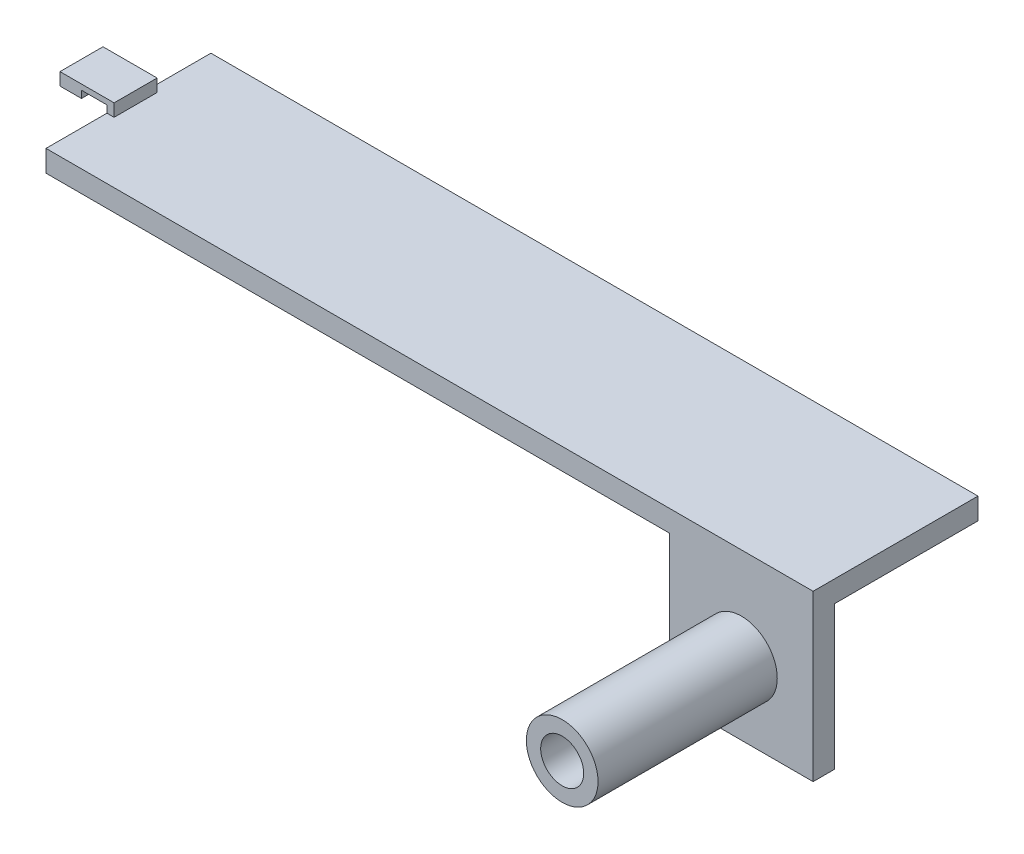
ISO-10303-21;
HEADER;
FILE_DESCRIPTION(('STEP AP214'),'2;1');
FILE_NAME('part.step','',(''),(''),'','','');
FILE_SCHEMA(('AUTOMOTIVE_DESIGN { 1 0 10303 214 1 1 1 1 }'));
ENDSEC;
DATA;
#1=APPLICATION_CONTEXT('core data for automotive mechanical design processes');
#2=APPLICATION_PROTOCOL_DEFINITION('international standard','automotive_design',2000,#1);
#3=PRODUCT_CONTEXT('',#1,'mechanical');
#4=PRODUCT('Part','Part','',(#3));
#5=PRODUCT_RELATED_PRODUCT_CATEGORY('part','',(#4));
#6=PRODUCT_DEFINITION_FORMATION('','',#4);
#7=PRODUCT_DEFINITION_CONTEXT('part definition',#1,'design');
#8=PRODUCT_DEFINITION('design','',#6,#7);
#9=PRODUCT_DEFINITION_SHAPE('','',#8);
#10=(LENGTH_UNIT() NAMED_UNIT(*) SI_UNIT(.MILLI.,.METRE.));
#11=(NAMED_UNIT(*) PLANE_ANGLE_UNIT() SI_UNIT($,.RADIAN.));
#12=(NAMED_UNIT(*) SI_UNIT($,.STERADIAN.) SOLID_ANGLE_UNIT());
#13=UNCERTAINTY_MEASURE_WITH_UNIT(LENGTH_MEASURE(1.E-05),#10,'distance_accuracy_value','');
#14=(GEOMETRIC_REPRESENTATION_CONTEXT(3) GLOBAL_UNCERTAINTY_ASSIGNED_CONTEXT((#13)) GLOBAL_UNIT_ASSIGNED_CONTEXT((#10,
#11,#12)) REPRESENTATION_CONTEXT('',''));
#15=CARTESIAN_POINT('',(0.,0.,0.));
#16=DIRECTION('',(0.,0.,1.));
#17=DIRECTION('',(1.,0.,0.));
#18=AXIS2_PLACEMENT_3D('',#15,#16,#17);
#19=CARTESIAN_POINT('',(-107.,-3.,0.));
#20=DIRECTION('',(0.,0.,-1.));
#21=DIRECTION('',(-1.,0.,0.));
#22=AXIS2_PLACEMENT_3D('',#19,#20,#21);
#23=PLANE('',#22);
#24=DIRECTION('',(0.,1.,0.));
#25=VECTOR('',#24,1.);
#26=CARTESIAN_POINT('',(0.,-3.,0.));
#27=LINE('',#26,#25);
#28=CARTESIAN_POINT('',(0.,-3.,0.));
#29=VERTEX_POINT('',#28);
#30=CARTESIAN_POINT('',(0.,0.,0.));
#31=VERTEX_POINT('',#30);
#32=EDGE_CURVE('E232',#29,#31,#27,.T.);
#33=ORIENTED_EDGE('',*,*,#32,.F.);
#34=DIRECTION('',(1.,0.,0.));
#35=VECTOR('',#34,1.);
#36=CARTESIAN_POINT('',(-107.,-3.,0.));
#37=LINE('',#36,#35);
#38=CARTESIAN_POINT('',(-107.,-3.,0.));
#39=VERTEX_POINT('',#38);
#40=EDGE_CURVE('E46',#39,#29,#37,.T.);
#41=ORIENTED_EDGE('',*,*,#40,.F.);
#42=DIRECTION('',(0.,1.,0.));
#43=VECTOR('',#42,1.);
#44=CARTESIAN_POINT('',(-107.,-3.,0.));
#45=LINE('',#44,#43);
#46=CARTESIAN_POINT('',(-107.,0.,0.));
#47=VERTEX_POINT('',#46);
#48=EDGE_CURVE('E233',#39,#47,#45,.T.);
#49=ORIENTED_EDGE('',*,*,#48,.T.);
#50=DIRECTION('',(1.,0.,0.));
#51=VECTOR('',#50,1.);
#52=CARTESIAN_POINT('',(-107.,0.,0.));
#53=LINE('',#52,#51);
#54=EDGE_CURVE('E246',#47,#31,#53,.T.);
#55=ORIENTED_EDGE('',*,*,#54,.T.);
#56=EDGE_LOOP('',(#33,#41,#49,#55));
#57=FACE_BOUND('',#56,.T.);
#58=ADVANCED_FACE('F39',(#57),#23,.T.);
#59=CARTESIAN_POINT('',(-107.,-3.,20.));
#60=DIRECTION('',(0.,-1.,0.));
#61=DIRECTION('',(0.,0.,-1.));
#62=AXIS2_PLACEMENT_3D('',#59,#60,#61);
#63=PLANE('',#62);
#64=DIRECTION('',(1.,0.,0.));
#65=VECTOR('',#64,1.);
#66=CARTESIAN_POINT('',(-107.,-3.,20.));
#67=LINE('',#66,#65);
#68=CARTESIAN_POINT('',(-20.,-3.,20.));
#69=VERTEX_POINT('',#68);
#70=CARTESIAN_POINT('',(0.,-3.,20.));
#71=VERTEX_POINT('',#70);
#72=EDGE_CURVE('E264',#69,#71,#67,.T.);
#73=ORIENTED_EDGE('',*,*,#72,.F.);
#74=DIRECTION('',(0.,0.,1.));
#75=VECTOR('',#74,1.);
#76=CARTESIAN_POINT('',(-20.,-3.,-2.));
#77=LINE('',#76,#75);
#78=CARTESIAN_POINT('',(-20.,-3.,23.));
#79=VERTEX_POINT('',#78);
#80=EDGE_CURVE('E227',#69,#79,#77,.T.);
#81=ORIENTED_EDGE('',*,*,#80,.T.);
#82=DIRECTION('',(-1.,0.,0.));
#83=VECTOR('',#82,1.);
#84=CARTESIAN_POINT('',(-107.,-3.,23.));
#85=LINE('',#84,#83);
#86=CARTESIAN_POINT('',(-107.,-3.,23.));
#87=VERTEX_POINT('',#86);
#88=EDGE_CURVE('E223',#79,#87,#85,.T.);
#89=ORIENTED_EDGE('',*,*,#88,.T.);
#90=DIRECTION('',(0.,0.,-1.));
#91=VECTOR('',#90,1.);
#92=CARTESIAN_POINT('',(-107.,-3.,20.));
#93=LINE('',#92,#91);
#94=EDGE_CURVE('E243',#87,#39,#93,.T.);
#95=ORIENTED_EDGE('',*,*,#94,.T.);
#96=ORIENTED_EDGE('',*,*,#40,.T.);
#97=DIRECTION('',(0.,0.,-1.));
#98=VECTOR('',#97,1.);
#99=CARTESIAN_POINT('',(0.,-3.,20.));
#100=LINE('',#99,#98);
#101=EDGE_CURVE('E237',#71,#29,#100,.T.);
#102=ORIENTED_EDGE('',*,*,#101,.F.);
#103=EDGE_LOOP('',(#73,#81,#89,#95,#96,#102));
#104=FACE_BOUND('',#103,.T.);
#105=ADVANCED_FACE('F285',(#104),#63,.T.);
#106=CARTESIAN_POINT('',(-107.,-23.,20.));
#107=DIRECTION('',(0.,0.,-1.));
#108=DIRECTION('',(0.,1.,0.));
#109=AXIS2_PLACEMENT_3D('',#106,#107,#108);
#110=PLANE('',#109);
#111=DIRECTION('',(0.,-1.,0.));
#112=VECTOR('',#111,1.);
#113=CARTESIAN_POINT('',(-20.,-23.,20.));
#114=LINE('',#113,#112);
#115=CARTESIAN_POINT('',(-20.,-23.,20.));
#116=VERTEX_POINT('',#115);
#117=EDGE_CURVE('E229',#69,#116,#114,.T.);
#118=ORIENTED_EDGE('',*,*,#117,.F.);
#119=ORIENTED_EDGE('',*,*,#72,.T.);
#120=DIRECTION('',(0.,1.,0.));
#121=VECTOR('',#120,1.);
#122=CARTESIAN_POINT('',(0.,-23.,20.));
#123=LINE('',#122,#121);
#124=CARTESIAN_POINT('',(0.,-23.,20.));
#125=VERTEX_POINT('',#124);
#126=EDGE_CURVE('E258',#125,#71,#123,.T.);
#127=ORIENTED_EDGE('',*,*,#126,.F.);
#128=DIRECTION('',(1.,0.,0.));
#129=VECTOR('',#128,1.);
#130=CARTESIAN_POINT('',(-107.,-23.,20.));
#131=LINE('',#130,#129);
#132=EDGE_CURVE('E266',#116,#125,#131,.T.);
#133=ORIENTED_EDGE('',*,*,#132,.F.);
#134=EDGE_LOOP('',(#118,#119,#127,#133));
#135=FACE_BOUND('',#134,.T.);
#136=ADVANCED_FACE('F320',(#135),#110,.T.);
#137=CARTESIAN_POINT('',(-107.,-23.,23.));
#138=DIRECTION('',(0.,-1.,0.));
#139=DIRECTION('',(0.,0.,-1.));
#140=AXIS2_PLACEMENT_3D('',#137,#138,#139);
#141=PLANE('',#140);
#142=DIRECTION('',(0.,0.,1.));
#143=VECTOR('',#142,1.);
#144=CARTESIAN_POINT('',(-20.,-23.,-2.));
#145=LINE('',#144,#143);
#146=CARTESIAN_POINT('',(-20.,-23.,23.));
#147=VERTEX_POINT('',#146);
#148=EDGE_CURVE('E226',#116,#147,#145,.T.);
#149=ORIENTED_EDGE('',*,*,#148,.F.);
#150=ORIENTED_EDGE('',*,*,#132,.T.);
#151=DIRECTION('',(0.,0.,-1.));
#152=VECTOR('',#151,1.);
#153=CARTESIAN_POINT('',(0.,-23.,23.));
#154=LINE('',#153,#152);
#155=CARTESIAN_POINT('',(0.,-23.,23.));
#156=VERTEX_POINT('',#155);
#157=EDGE_CURVE('E255',#156,#125,#154,.T.);
#158=ORIENTED_EDGE('',*,*,#157,.F.);
#159=DIRECTION('',(1.,0.,0.));
#160=VECTOR('',#159,1.);
#161=CARTESIAN_POINT('',(-107.,-23.,23.));
#162=LINE('',#161,#160);
#163=EDGE_CURVE('E268',#147,#156,#162,.T.);
#164=ORIENTED_EDGE('',*,*,#163,.F.);
#165=EDGE_LOOP('',(#149,#150,#158,#164));
#166=FACE_BOUND('',#165,.T.);
#167=ADVANCED_FACE('F316',(#166),#141,.T.);
#168=CARTESIAN_POINT('',(-107.,0.,23.));
#169=DIRECTION('',(0.,0.,1.));
#170=DIRECTION('',(0.,-1.,0.));
#171=AXIS2_PLACEMENT_3D('',#168,#169,#170);
#172=PLANE('',#171);
#173=CARTESIAN_POINT('',(-10.,-13.,23.));
#174=DIRECTION('',(0.,0.,1.));
#175=DIRECTION('',(1.,0.,0.));
#176=AXIS2_PLACEMENT_3D('',#173,#174,#175);
#177=CIRCLE('',#176,5.);
#178=CARTESIAN_POINT('',(-5.,-13.,23.));
#179=VERTEX_POINT('',#178);
#180=EDGE_CURVE('E214',#179,#179,#177,.T.);
#181=ORIENTED_EDGE('',*,*,#180,.F.);
#182=EDGE_LOOP('',(#181));
#183=FACE_BOUND('',#182,.T.);
#184=ORIENTED_EDGE('',*,*,#88,.F.);
#185=DIRECTION('',(0.,1.,0.));
#186=VECTOR('',#185,1.);
#187=CARTESIAN_POINT('',(-20.,-3.,23.));
#188=LINE('',#187,#186);
#189=EDGE_CURVE('E218',#147,#79,#188,.T.);
#190=ORIENTED_EDGE('',*,*,#189,.F.);
#191=ORIENTED_EDGE('',*,*,#163,.T.);
#192=DIRECTION('',(0.,-1.,0.));
#193=VECTOR('',#192,1.);
#194=CARTESIAN_POINT('',(0.,0.,23.));
#195=LINE('',#194,#193);
#196=CARTESIAN_POINT('',(0.,0.,23.));
#197=VERTEX_POINT('',#196);
#198=EDGE_CURVE('E252',#197,#156,#195,.T.);
#199=ORIENTED_EDGE('',*,*,#198,.F.);
#200=DIRECTION('',(1.,0.,0.));
#201=VECTOR('',#200,1.);
#202=CARTESIAN_POINT('',(-107.,0.,23.));
#203=LINE('',#202,#201);
#204=CARTESIAN_POINT('',(-107.,0.,23.));
#205=VERTEX_POINT('',#204);
#206=EDGE_CURVE('E270',#205,#197,#203,.T.);
#207=ORIENTED_EDGE('',*,*,#206,.F.);
#208=DIRECTION('',(0.,-1.,0.));
#209=VECTOR('',#208,1.);
#210=CARTESIAN_POINT('',(-107.,0.,23.));
#211=LINE('',#210,#209);
#212=EDGE_CURVE('E240',#205,#87,#211,.T.);
#213=ORIENTED_EDGE('',*,*,#212,.T.);
#214=EDGE_LOOP('',(#184,#190,#191,#199,#207,#213));
#215=FACE_BOUND('',#214,.T.);
#216=ADVANCED_FACE('F310',(#183,#215),#172,.T.);
#217=CARTESIAN_POINT('',(-107.,0.,0.));
#218=DIRECTION('',(0.,1.,0.));
#219=DIRECTION('',(0.,0.,1.));
#220=AXIS2_PLACEMENT_3D('',#217,#218,#219);
#221=PLANE('',#220);
#222=DIRECTION('',(1.,0.,0.));
#223=VECTOR('',#222,1.);
#224=CARTESIAN_POINT('',(-107.,0.,8.5));
#225=LINE('',#224,#223);
#226=CARTESIAN_POINT('',(-107.,0.,8.5));
#227=VERTEX_POINT('',#226);
#228=CARTESIAN_POINT('',(-106.,0.,8.5));
#229=VERTEX_POINT('',#228);
#230=EDGE_CURVE('E53',#227,#229,#225,.T.);
#231=ORIENTED_EDGE('',*,*,#230,.T.);
#232=DIRECTION('',(0.,0.,1.));
#233=VECTOR('',#232,1.);
#234=CARTESIAN_POINT('',(-106.,0.,8.5));
#235=LINE('',#234,#233);
#236=CARTESIAN_POINT('',(-106.,0.,14.5));
#237=VERTEX_POINT('',#236);
#238=EDGE_CURVE('E57',#229,#237,#235,.T.);
#239=ORIENTED_EDGE('',*,*,#238,.T.);
#240=DIRECTION('',(1.,0.,0.));
#241=VECTOR('',#240,1.);
#242=CARTESIAN_POINT('',(-107.,0.,14.5));
#243=LINE('',#242,#241);
#244=CARTESIAN_POINT('',(-107.,0.,14.5));
#245=VERTEX_POINT('',#244);
#246=EDGE_CURVE('E162',#245,#237,#243,.T.);
#247=ORIENTED_EDGE('',*,*,#246,.F.);
#248=DIRECTION('',(0.,0.,1.));
#249=VECTOR('',#248,1.);
#250=CARTESIAN_POINT('',(-107.,0.,0.));
#251=LINE('',#250,#249);
#252=EDGE_CURVE('E236',#245,#205,#251,.T.);
#253=ORIENTED_EDGE('',*,*,#252,.T.);
#254=ORIENTED_EDGE('',*,*,#206,.T.);
#255=DIRECTION('',(0.,0.,1.));
#256=VECTOR('',#255,1.);
#257=CARTESIAN_POINT('',(0.,0.,0.));
#258=LINE('',#257,#256);
#259=EDGE_CURVE('E249',#31,#197,#258,.T.);
#260=ORIENTED_EDGE('',*,*,#259,.F.);
#261=ORIENTED_EDGE('',*,*,#54,.F.);
#262=EDGE_CURVE('E238',#47,#227,#251,.T.);
#263=ORIENTED_EDGE('',*,*,#262,.T.);
#264=EDGE_LOOP('',(#231,#239,#247,#253,#254,#260,#261,#263));
#265=FACE_BOUND('',#264,.T.);
#266=ADVANCED_FACE('F276',(#265),#221,.T.);
#267=CARTESIAN_POINT('',(-107.,0.,0.));
#268=DIRECTION('',(1.,0.,0.));
#269=DIRECTION('',(0.,0.,-1.));
#270=AXIS2_PLACEMENT_3D('',#267,#268,#269);
#271=PLANE('',#270);
#272=ORIENTED_EDGE('',*,*,#94,.F.);
#273=ORIENTED_EDGE('',*,*,#212,.F.);
#274=ORIENTED_EDGE('',*,*,#252,.F.);
#275=DIRECTION('',(0.,-1.,0.));
#276=VECTOR('',#275,1.);
#277=CARTESIAN_POINT('',(-107.,0.,14.5));
#278=LINE('',#277,#276);
#279=CARTESIAN_POINT('',(-107.,1.,14.5));
#280=VERTEX_POINT('',#279);
#281=EDGE_CURVE('E180',#280,#245,#278,.T.);
#282=ORIENTED_EDGE('',*,*,#281,.F.);
#283=DIRECTION('',(0.,0.,1.));
#284=VECTOR('',#283,1.);
#285=CARTESIAN_POINT('',(-107.,1.,8.5));
#286=LINE('',#285,#284);
#287=CARTESIAN_POINT('',(-107.,1.,8.5));
#288=VERTEX_POINT('',#287);
#289=EDGE_CURVE('E201',#288,#280,#286,.T.);
#290=ORIENTED_EDGE('',*,*,#289,.F.);
#291=DIRECTION('',(0.,-1.,0.));
#292=VECTOR('',#291,1.);
#293=CARTESIAN_POINT('',(-107.,0.,8.5));
#294=LINE('',#293,#292);
#295=EDGE_CURVE('E198',#288,#227,#294,.T.);
#296=ORIENTED_EDGE('',*,*,#295,.T.);
#297=ORIENTED_EDGE('',*,*,#262,.F.);
#298=ORIENTED_EDGE('',*,*,#48,.F.);
#299=EDGE_LOOP('',(#272,#273,#274,#282,#290,#296,#297,#298));
#300=FACE_BOUND('',#299,.T.);
#301=ADVANCED_FACE('F287',(#300),#271,.F.);
#302=CARTESIAN_POINT('',(0.,0.,0.));
#303=DIRECTION('',(1.,0.,0.));
#304=DIRECTION('',(0.,0.,-1.));
#305=AXIS2_PLACEMENT_3D('',#302,#303,#304);
#306=PLANE('',#305);
#307=ORIENTED_EDGE('',*,*,#32,.T.);
#308=ORIENTED_EDGE('',*,*,#259,.T.);
#309=ORIENTED_EDGE('',*,*,#198,.T.);
#310=ORIENTED_EDGE('',*,*,#157,.T.);
#311=ORIENTED_EDGE('',*,*,#126,.T.);
#312=ORIENTED_EDGE('',*,*,#101,.T.);
#313=EDGE_LOOP('',(#307,#308,#309,#310,#311,#312));
#314=FACE_BOUND('',#313,.T.);
#315=ADVANCED_FACE('F280',(#314),#306,.T.);
#316=CARTESIAN_POINT('',(-20.,-3.,-2.));
#317=DIRECTION('',(1.,0.,0.));
#318=DIRECTION('',(0.,0.,-1.));
#319=AXIS2_PLACEMENT_3D('',#316,#317,#318);
#320=PLANE('',#319);
#321=ORIENTED_EDGE('',*,*,#117,.T.);
#322=ORIENTED_EDGE('',*,*,#148,.T.);
#323=ORIENTED_EDGE('',*,*,#189,.T.);
#324=ORIENTED_EDGE('',*,*,#80,.F.);
#325=EDGE_LOOP('',(#321,#322,#323,#324));
#326=FACE_BOUND('',#325,.T.);
#327=ADVANCED_FACE('F322',(#326),#320,.F.);
#328=CARTESIAN_POINT('',(-10.,-13.,48.));
#329=DIRECTION('',(0.,0.,1.));
#330=DIRECTION('',(1.,0.,0.));
#331=AXIS2_PLACEMENT_3D('',#328,#329,#330);
#332=PLANE('',#331);
#333=CARTESIAN_POINT('',(-10.,-13.,48.));
#334=DIRECTION('',(0.,0.,1.));
#335=DIRECTION('',(1.,0.,0.));
#336=AXIS2_PLACEMENT_3D('',#333,#334,#335);
#337=CIRCLE('',#336,5.);
#338=CARTESIAN_POINT('',(-5.,-13.,48.));
#339=VERTEX_POINT('',#338);
#340=EDGE_CURVE('E215',#339,#339,#337,.T.);
#341=ORIENTED_EDGE('',*,*,#340,.T.);
#342=EDGE_LOOP('',(#341));
#343=FACE_BOUND('',#342,.T.);
#344=CARTESIAN_POINT('',(-10.,-13.,48.));
#345=DIRECTION('',(0.,0.,1.));
#346=DIRECTION('',(1.,0.,0.));
#347=AXIS2_PLACEMENT_3D('',#344,#345,#346);
#348=CIRCLE('',#347,3.);
#349=CARTESIAN_POINT('',(-7.,-13.,48.));
#350=VERTEX_POINT('',#349);
#351=EDGE_CURVE('E203',#350,#350,#348,.T.);
#352=ORIENTED_EDGE('',*,*,#351,.F.);
#353=EDGE_LOOP('',(#352));
#354=FACE_BOUND('',#353,.T.);
#355=ADVANCED_FACE('F324',(#343,#354),#332,.T.);
#356=CARTESIAN_POINT('',(-10.,-13.,48.));
#357=DIRECTION('',(0.,0.,-1.));
#358=DIRECTION('',(-1.,0.,0.));
#359=AXIS2_PLACEMENT_3D('',#356,#357,#358);
#360=CYLINDRICAL_SURFACE('',#359,5.);
#361=ORIENTED_EDGE('',*,*,#340,.F.);
#362=EDGE_LOOP('',(#361));
#363=FACE_BOUND('',#362,.T.);
#364=ORIENTED_EDGE('',*,*,#180,.T.);
#365=EDGE_LOOP('',(#364));
#366=FACE_BOUND('',#365,.T.);
#367=ADVANCED_FACE('F330',(#363,#366),#360,.T.);
#368=CARTESIAN_POINT('',(-10.,-13.,48.));
#369=DIRECTION('',(0.,0.,-1.));
#370=DIRECTION('',(-1.,0.,0.));
#371=AXIS2_PLACEMENT_3D('',#368,#369,#370);
#372=CYLINDRICAL_SURFACE('',#371,3.);
#373=ORIENTED_EDGE('',*,*,#351,.T.);
#374=EDGE_LOOP('',(#373));
#375=FACE_BOUND('',#374,.T.);
#376=CARTESIAN_POINT('',(-10.,-13.,23.));
#377=DIRECTION('',(0.,0.,1.));
#378=DIRECTION('',(0.,-1.,0.));
#379=AXIS2_PLACEMENT_3D('',#376,#377,#378);
#380=CIRCLE('',#379,3.);
#381=CARTESIAN_POINT('',(-10.,-16.,23.));
#382=VERTEX_POINT('',#381);
#383=EDGE_CURVE('E11',#382,#382,#380,.F.);
#384=ORIENTED_EDGE('',*,*,#383,.T.);
#385=EDGE_LOOP('',(#384));
#386=FACE_BOUND('',#385,.T.);
#387=ADVANCED_FACE('F418',(#375,#386),#372,.F.);
#388=ORIENTED_EDGE('',*,*,#383,.F.);
#389=EDGE_LOOP('',(#388));
#390=FACE_BOUND('',#389,.T.);
#391=ADVANCED_FACE('F350',(#390),#172,.T.);
#392=CARTESIAN_POINT('',(-110.55,1.,8.5));
#393=DIRECTION('',(0.,-1.,0.));
#394=DIRECTION('',(1.,0.,0.));
#395=AXIS2_PLACEMENT_3D('',#392,#393,#394);
#396=PLANE('',#395);
#397=ORIENTED_EDGE('',*,*,#289,.T.);
#398=DIRECTION('',(1.,0.,0.));
#399=VECTOR('',#398,1.);
#400=CARTESIAN_POINT('',(-110.55,1.,14.5));
#401=LINE('',#400,#399);
#402=CARTESIAN_POINT('',(-110.55,1.,14.5));
#403=VERTEX_POINT('',#402);
#404=EDGE_CURVE('E177',#403,#280,#401,.T.);
#405=ORIENTED_EDGE('',*,*,#404,.F.);
#406=DIRECTION('',(0.,0.,1.));
#407=VECTOR('',#406,1.);
#408=CARTESIAN_POINT('',(-110.55,1.,8.5));
#409=LINE('',#408,#407);
#410=CARTESIAN_POINT('',(-110.55,1.,8.5));
#411=VERTEX_POINT('',#410);
#412=EDGE_CURVE('E204',#411,#403,#409,.T.);
#413=ORIENTED_EDGE('',*,*,#412,.F.);
#414=DIRECTION('',(1.,0.,0.));
#415=VECTOR('',#414,1.);
#416=CARTESIAN_POINT('',(-110.55,1.,8.5));
#417=LINE('',#416,#415);
#418=EDGE_CURVE('E195',#411,#288,#417,.T.);
#419=ORIENTED_EDGE('',*,*,#418,.T.);
#420=EDGE_LOOP('',(#397,#405,#413,#419));
#421=FACE_BOUND('',#420,.T.);
#422=ADVANCED_FACE('F305',(#421),#396,.T.);
#423=CARTESIAN_POINT('',(-110.55,1.,8.5));
#424=DIRECTION('',(1.,0.,0.));
#425=DIRECTION('',(0.,0.,-1.));
#426=AXIS2_PLACEMENT_3D('',#423,#424,#425);
#427=PLANE('',#426);
#428=ORIENTED_EDGE('',*,*,#412,.T.);
#429=DIRECTION('',(0.,1.,0.));
#430=VECTOR('',#429,1.);
#431=CARTESIAN_POINT('',(-110.55,1.,14.5));
#432=LINE('',#431,#430);
#433=CARTESIAN_POINT('',(-110.55,0.,14.5));
#434=VERTEX_POINT('',#433);
#435=EDGE_CURVE('E174',#434,#403,#432,.T.);
#436=ORIENTED_EDGE('',*,*,#435,.F.);
#437=DIRECTION('',(0.,0.,1.));
#438=VECTOR('',#437,1.);
#439=CARTESIAN_POINT('',(-110.55,0.,8.5));
#440=LINE('',#439,#438);
#441=CARTESIAN_POINT('',(-110.55,0.,8.5));
#442=VERTEX_POINT('',#441);
#443=EDGE_CURVE('E206',#442,#434,#440,.T.);
#444=ORIENTED_EDGE('',*,*,#443,.F.);
#445=DIRECTION('',(0.,1.,0.));
#446=VECTOR('',#445,1.);
#447=CARTESIAN_POINT('',(-110.55,1.,8.5));
#448=LINE('',#447,#446);
#449=EDGE_CURVE('E192',#442,#411,#448,.T.);
#450=ORIENTED_EDGE('',*,*,#449,.T.);
#451=EDGE_LOOP('',(#428,#436,#444,#450));
#452=FACE_BOUND('',#451,.T.);
#453=ADVANCED_FACE('F303',(#452),#427,.T.);
#454=CARTESIAN_POINT('',(-110.55,0.,8.5));
#455=DIRECTION('',(0.,-1.,0.));
#456=DIRECTION('',(1.,0.,0.));
#457=AXIS2_PLACEMENT_3D('',#454,#455,#456);
#458=PLANE('',#457);
#459=ORIENTED_EDGE('',*,*,#443,.T.);
#460=DIRECTION('',(1.,0.,0.));
#461=VECTOR('',#460,1.);
#462=CARTESIAN_POINT('',(-110.55,0.,14.5));
#463=LINE('',#462,#461);
#464=CARTESIAN_POINT('',(-113.55,0.,14.5));
#465=VERTEX_POINT('',#464);
#466=EDGE_CURVE('E168',#465,#434,#463,.T.);
#467=ORIENTED_EDGE('',*,*,#466,.F.);
#468=DIRECTION('',(0.,0.,1.));
#469=VECTOR('',#468,1.);
#470=CARTESIAN_POINT('',(-113.55,0.,8.5));
#471=LINE('',#470,#469);
#472=CARTESIAN_POINT('',(-113.55,0.,8.5));
#473=VERTEX_POINT('',#472);
#474=EDGE_CURVE('E208',#473,#465,#471,.T.);
#475=ORIENTED_EDGE('',*,*,#474,.F.);
#476=DIRECTION('',(1.,0.,0.));
#477=VECTOR('',#476,1.);
#478=CARTESIAN_POINT('',(-110.55,0.,8.5));
#479=LINE('',#478,#477);
#480=EDGE_CURVE('E189',#473,#442,#479,.T.);
#481=ORIENTED_EDGE('',*,*,#480,.T.);
#482=EDGE_LOOP('',(#459,#467,#475,#481));
#483=FACE_BOUND('',#482,.T.);
#484=ADVANCED_FACE('F300',(#483),#458,.T.);
#485=CARTESIAN_POINT('',(-113.55,1.75,8.5));
#486=DIRECTION('',(-1.,0.,0.));
#487=DIRECTION('',(0.,0.,1.));
#488=AXIS2_PLACEMENT_3D('',#485,#486,#487);
#489=PLANE('',#488);
#490=ORIENTED_EDGE('',*,*,#474,.T.);
#491=DIRECTION('',(0.,-1.,0.));
#492=VECTOR('',#491,1.);
#493=CARTESIAN_POINT('',(-113.55,1.75,14.5));
#494=LINE('',#493,#492);
#495=CARTESIAN_POINT('',(-113.55,1.75,14.5));
#496=VERTEX_POINT('',#495);
#497=EDGE_CURVE('E166',#496,#465,#494,.T.);
#498=ORIENTED_EDGE('',*,*,#497,.F.);
#499=DIRECTION('',(0.,0.,1.));
#500=VECTOR('',#499,1.);
#501=CARTESIAN_POINT('',(-113.55,1.75,8.5));
#502=LINE('',#501,#500);
#503=CARTESIAN_POINT('',(-113.55,1.75,8.5));
#504=VERTEX_POINT('',#503);
#505=EDGE_CURVE('E153',#504,#496,#502,.T.);
#506=ORIENTED_EDGE('',*,*,#505,.F.);
#507=DIRECTION('',(0.,-1.,0.));
#508=VECTOR('',#507,1.);
#509=CARTESIAN_POINT('',(-113.55,1.75,8.5));
#510=LINE('',#509,#508);
#511=EDGE_CURVE('E186',#504,#473,#510,.T.);
#512=ORIENTED_EDGE('',*,*,#511,.T.);
#513=EDGE_LOOP('',(#490,#498,#506,#512));
#514=FACE_BOUND('',#513,.T.);
#515=ADVANCED_FACE('F296',(#514),#489,.T.);
#516=CARTESIAN_POINT('',(-110.55,1.75,8.5));
#517=DIRECTION('',(0.,1.,0.));
#518=DIRECTION('',(-1.,0.,0.));
#519=AXIS2_PLACEMENT_3D('',#516,#517,#518);
#520=PLANE('',#519);
#521=ORIENTED_EDGE('',*,*,#505,.T.);
#522=DIRECTION('',(-1.,0.,0.));
#523=VECTOR('',#522,1.);
#524=CARTESIAN_POINT('',(-110.55,1.75,14.5));
#525=LINE('',#524,#523);
#526=CARTESIAN_POINT('',(-106.,1.75,14.5));
#527=VERTEX_POINT('',#526);
#528=EDGE_CURVE('E159',#527,#496,#525,.T.);
#529=ORIENTED_EDGE('',*,*,#528,.F.);
#530=DIRECTION('',(0.,0.,1.));
#531=VECTOR('',#530,1.);
#532=CARTESIAN_POINT('',(-106.,1.75,8.5));
#533=LINE('',#532,#531);
#534=CARTESIAN_POINT('',(-106.,1.75,8.5));
#535=VERTEX_POINT('',#534);
#536=EDGE_CURVE('E143',#535,#527,#533,.T.);
#537=ORIENTED_EDGE('',*,*,#536,.F.);
#538=DIRECTION('',(-1.,0.,0.));
#539=VECTOR('',#538,1.);
#540=CARTESIAN_POINT('',(-110.55,1.75,8.5));
#541=LINE('',#540,#539);
#542=EDGE_CURVE('E184',#535,#504,#541,.T.);
#543=ORIENTED_EDGE('',*,*,#542,.T.);
#544=EDGE_LOOP('',(#521,#529,#537,#543));
#545=FACE_BOUND('',#544,.T.);
#546=ADVANCED_FACE('F164',(#545),#520,.T.);
#547=CARTESIAN_POINT('',(-106.,1.75,8.5));
#548=DIRECTION('',(1.,0.,0.));
#549=DIRECTION('',(0.,0.,-1.));
#550=AXIS2_PLACEMENT_3D('',#547,#548,#549);
#551=PLANE('',#550);
#552=ORIENTED_EDGE('',*,*,#536,.T.);
#553=DIRECTION('',(0.,1.,0.));
#554=VECTOR('',#553,1.);
#555=CARTESIAN_POINT('',(-106.,1.75,14.5));
#556=LINE('',#555,#554);
#557=EDGE_CURVE('E146',#237,#527,#556,.T.);
#558=ORIENTED_EDGE('',*,*,#557,.F.);
#559=ORIENTED_EDGE('',*,*,#238,.F.);
#560=DIRECTION('',(0.,1.,0.));
#561=VECTOR('',#560,1.);
#562=CARTESIAN_POINT('',(-106.,1.75,8.5));
#563=LINE('',#562,#561);
#564=EDGE_CURVE('E149',#229,#535,#563,.T.);
#565=ORIENTED_EDGE('',*,*,#564,.T.);
#566=EDGE_LOOP('',(#552,#558,#559,#565));
#567=FACE_BOUND('',#566,.T.);
#568=ADVANCED_FACE('F145',(#567),#551,.T.);
#569=CARTESIAN_POINT('',(0.,0.,8.5));
#570=DIRECTION('',(0.,0.,-1.));
#571=DIRECTION('',(-1.,0.,0.));
#572=AXIS2_PLACEMENT_3D('',#569,#570,#571);
#573=PLANE('',#572);
#574=ORIENTED_EDGE('',*,*,#230,.F.);
#575=ORIENTED_EDGE('',*,*,#295,.F.);
#576=ORIENTED_EDGE('',*,*,#418,.F.);
#577=ORIENTED_EDGE('',*,*,#449,.F.);
#578=ORIENTED_EDGE('',*,*,#480,.F.);
#579=ORIENTED_EDGE('',*,*,#511,.F.);
#580=ORIENTED_EDGE('',*,*,#542,.F.);
#581=ORIENTED_EDGE('',*,*,#564,.F.);
#582=EDGE_LOOP('',(#574,#575,#576,#577,#578,#579,#580,#581));
#583=FACE_BOUND('',#582,.T.);
#584=ADVANCED_FACE('F291',(#583),#573,.T.);
#585=CARTESIAN_POINT('',(0.,0.,14.5));
#586=DIRECTION('',(0.,0.,-1.));
#587=DIRECTION('',(-1.,0.,0.));
#588=AXIS2_PLACEMENT_3D('',#585,#586,#587);
#589=PLANE('',#588);
#590=ORIENTED_EDGE('',*,*,#246,.T.);
#591=ORIENTED_EDGE('',*,*,#557,.T.);
#592=ORIENTED_EDGE('',*,*,#528,.T.);
#593=ORIENTED_EDGE('',*,*,#497,.T.);
#594=ORIENTED_EDGE('',*,*,#466,.T.);
#595=ORIENTED_EDGE('',*,*,#435,.T.);
#596=ORIENTED_EDGE('',*,*,#404,.T.);
#597=ORIENTED_EDGE('',*,*,#281,.T.);
#598=EDGE_LOOP('',(#590,#591,#592,#593,#594,#595,#596,#597));
#599=FACE_BOUND('',#598,.T.);
#600=ADVANCED_FACE('F157',(#599),#589,.F.);
#601=CLOSED_SHELL('',(#58,#105,#136,#167,#216,#266,#301,#315,#327,#355,#367,#387,#391,#422,#453,
#484,#515,#546,#568,#584,#600));
#602=MANIFOLD_SOLID_BREP('B2',#601);
#603=ADVANCED_BREP_SHAPE_REPRESENTATION('',(#18,#602),#14);
#604=SHAPE_DEFINITION_REPRESENTATION(#9,#603);
ENDSEC;
END-ISO-10303-21;
